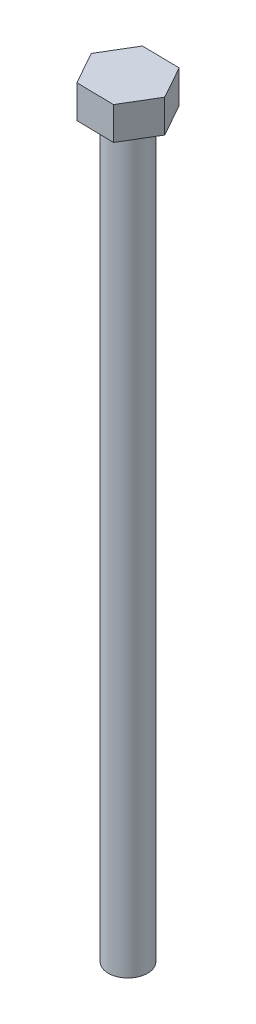
ISO-10303-21;
HEADER;
FILE_DESCRIPTION(('STEP AP214'),'2;1');
FILE_NAME('part.step','',(''),(''),'','','');
FILE_SCHEMA(('AUTOMOTIVE_DESIGN { 1 0 10303 214 1 1 1 1 }'));
ENDSEC;
DATA;
#1=APPLICATION_CONTEXT('core data for automotive mechanical design processes');
#2=APPLICATION_PROTOCOL_DEFINITION('international standard','automotive_design',2000,#1);
#3=PRODUCT_CONTEXT('',#1,'mechanical');
#4=PRODUCT('Part','Part','',(#3));
#5=PRODUCT_RELATED_PRODUCT_CATEGORY('part','',(#4));
#6=PRODUCT_DEFINITION_FORMATION('','',#4);
#7=PRODUCT_DEFINITION_CONTEXT('part definition',#1,'design');
#8=PRODUCT_DEFINITION('design','',#6,#7);
#9=PRODUCT_DEFINITION_SHAPE('','',#8);
#10=(LENGTH_UNIT() NAMED_UNIT(*) SI_UNIT(.MILLI.,.METRE.));
#11=(NAMED_UNIT(*) PLANE_ANGLE_UNIT() SI_UNIT($,.RADIAN.));
#12=(NAMED_UNIT(*) SI_UNIT($,.STERADIAN.) SOLID_ANGLE_UNIT());
#13=UNCERTAINTY_MEASURE_WITH_UNIT(LENGTH_MEASURE(1.E-05),#10,'distance_accuracy_value','');
#14=(GEOMETRIC_REPRESENTATION_CONTEXT(3) GLOBAL_UNCERTAINTY_ASSIGNED_CONTEXT((#13)) GLOBAL_UNIT_ASSIGNED_CONTEXT((#10,
#11,#12)) REPRESENTATION_CONTEXT('',''));
#15=CARTESIAN_POINT('',(0.,0.,0.));
#16=DIRECTION('',(0.,0.,1.));
#17=DIRECTION('',(1.,0.,0.));
#18=AXIS2_PLACEMENT_3D('',#15,#16,#17);
#19=CARTESIAN_POINT('',(0.,112.,0.));
#20=DIRECTION('',(0.,-1.,0.));
#21=DIRECTION('',(0.,0.,-1.));
#22=AXIS2_PLACEMENT_3D('',#19,#20,#21);
#23=CYLINDRICAL_SURFACE('',#22,3.);
#24=CARTESIAN_POINT('',(0.,112.,0.));
#25=DIRECTION('',(0.,1.,0.));
#26=DIRECTION('',(0.,0.,1.));
#27=AXIS2_PLACEMENT_3D('',#24,#25,#26);
#28=CIRCLE('',#27,3.);
#29=CARTESIAN_POINT('',(0.,112.,3.));
#30=VERTEX_POINT('',#29);
#31=EDGE_CURVE('E11',#30,#30,#28,.T.);
#32=ORIENTED_EDGE('',*,*,#31,.F.);
#33=EDGE_LOOP('',(#32));
#34=FACE_BOUND('',#33,.T.);
#35=CARTESIAN_POINT('',(0.,0.,0.));
#36=DIRECTION('',(0.,1.,0.));
#37=DIRECTION('',(0.,0.,1.));
#38=AXIS2_PLACEMENT_3D('',#35,#36,#37);
#39=CIRCLE('',#38,3.);
#40=CARTESIAN_POINT('',(0.,0.,3.));
#41=VERTEX_POINT('',#40);
#42=EDGE_CURVE('E36',#41,#41,#39,.T.);
#43=ORIENTED_EDGE('',*,*,#42,.T.);
#44=EDGE_LOOP('',(#43));
#45=FACE_BOUND('',#44,.T.);
#46=ADVANCED_FACE('F33',(#34,#45),#23,.T.);
#47=CARTESIAN_POINT('',(0.,0.,0.));
#48=DIRECTION('',(0.,1.,0.));
#49=DIRECTION('',(0.,0.,1.));
#50=AXIS2_PLACEMENT_3D('',#47,#48,#49);
#51=PLANE('',#50);
#52=ORIENTED_EDGE('',*,*,#42,.F.);
#53=EDGE_LOOP('',(#52));
#54=FACE_BOUND('',#53,.T.);
#55=ADVANCED_FACE('F141',(#54),#51,.F.);
#56=CARTESIAN_POINT('',(5.68176027461235,117.,0.0886843846860412));
#57=DIRECTION('',(-0.873723283610165,0.,0.486423296807906));
#58=DIRECTION('',(0.486423296807906,0.,0.873723283610165));
#59=AXIS2_PLACEMENT_3D('',#56,#57,#58);
#60=PLANE('',#59);
#61=DIRECTION('',(-0.486423296807906,0.,-0.873723283610165));
#62=VECTOR('',#61,1.);
#63=CARTESIAN_POINT('',(5.68176027461235,112.,0.0886843846860412));
#64=LINE('',#63,#62);
#65=CARTESIAN_POINT('',(5.68176027461235,112.,0.0886843846860412));
#66=VERTEX_POINT('',#65);
#67=CARTESIAN_POINT('',(2.91768306736328,112.,-4.87620654368452));
#68=VERTEX_POINT('',#67);
#69=EDGE_CURVE('E118',#66,#68,#64,.T.);
#70=ORIENTED_EDGE('',*,*,#69,.T.);
#71=DIRECTION('',(0.,-1.,0.));
#72=VECTOR('',#71,1.);
#73=CARTESIAN_POINT('',(2.91768306736328,117.,-4.87620654368452));
#74=LINE('',#73,#72);
#75=CARTESIAN_POINT('',(2.91768306736328,117.,-4.87620654368452));
#76=VERTEX_POINT('',#75);
#77=EDGE_CURVE('E135',#76,#68,#74,.T.);
#78=ORIENTED_EDGE('',*,*,#77,.F.);
#79=DIRECTION('',(-0.486423296807906,0.,-0.873723283610165));
#80=VECTOR('',#79,1.);
#81=CARTESIAN_POINT('',(5.68176027461235,117.,0.0886843846860412));
#82=LINE('',#81,#80);
#83=CARTESIAN_POINT('',(5.68176027461235,117.,0.0886843846860412));
#84=VERTEX_POINT('',#83);
#85=EDGE_CURVE('E128',#84,#76,#82,.T.);
#86=ORIENTED_EDGE('',*,*,#85,.F.);
#87=DIRECTION('',(0.,-1.,0.));
#88=VECTOR('',#87,1.);
#89=CARTESIAN_POINT('',(5.68176027461235,117.,0.0886843846860412));
#90=LINE('',#89,#88);
#91=EDGE_CURVE('E114',#84,#66,#90,.T.);
#92=ORIENTED_EDGE('',*,*,#91,.T.);
#93=EDGE_LOOP('',(#70,#78,#86,#92));
#94=FACE_BOUND('',#93,.T.);
#95=ADVANCED_FACE('F143',(#94),#60,.F.);
#96=CARTESIAN_POINT('',(2.91768306736328,117.,-4.87620654368452));
#97=DIRECTION('',(-0.0156067097768582,0.,0.999878207888311));
#98=DIRECTION('',(0.999878207888311,0.,0.0156067097768582));
#99=AXIS2_PLACEMENT_3D('',#96,#97,#98);
#100=PLANE('',#99);
#101=DIRECTION('',(-0.999878207888311,0.,-0.0156067097768582));
#102=VECTOR('',#101,1.);
#103=CARTESIAN_POINT('',(2.91768306736328,112.,-4.87620654368452));
#104=LINE('',#103,#102);
#105=CARTESIAN_POINT('',(-2.76407720724907,112.,-4.96489092837056));
#106=VERTEX_POINT('',#105);
#107=EDGE_CURVE('E121',#68,#106,#104,.T.);
#108=ORIENTED_EDGE('',*,*,#107,.T.);
#109=DIRECTION('',(0.,-1.,0.));
#110=VECTOR('',#109,1.);
#111=CARTESIAN_POINT('',(-2.76407720724907,117.,-4.96489092837056));
#112=LINE('',#111,#110);
#113=CARTESIAN_POINT('',(-2.76407720724907,117.,-4.96489092837056));
#114=VERTEX_POINT('',#113);
#115=EDGE_CURVE('E132',#114,#106,#112,.T.);
#116=ORIENTED_EDGE('',*,*,#115,.F.);
#117=DIRECTION('',(-0.999878207888311,0.,-0.0156067097768582));
#118=VECTOR('',#117,1.);
#119=CARTESIAN_POINT('',(2.91768306736328,117.,-4.87620654368452));
#120=LINE('',#119,#118);
#121=EDGE_CURVE('E87',#76,#114,#120,.T.);
#122=ORIENTED_EDGE('',*,*,#121,.F.);
#123=ORIENTED_EDGE('',*,*,#77,.T.);
#124=EDGE_LOOP('',(#108,#116,#122,#123));
#125=FACE_BOUND('',#124,.T.);
#126=ADVANCED_FACE('F148',(#125),#100,.F.);
#127=CARTESIAN_POINT('',(-2.76407720724907,117.,-4.96489092837056));
#128=DIRECTION('',(0.858116573833307,0.,0.513454911080405));
#129=DIRECTION('',(0.513454911080405,0.,-0.858116573833307));
#130=AXIS2_PLACEMENT_3D('',#127,#128,#129);
#131=PLANE('',#130);
#132=DIRECTION('',(-0.513454911080405,0.,0.858116573833307));
#133=VECTOR('',#132,1.);
#134=CARTESIAN_POINT('',(-2.76407720724907,112.,-4.96489092837056));
#135=LINE('',#134,#133);
#136=CARTESIAN_POINT('',(-5.68176027461235,112.,-0.0886843846860386));
#137=VERTEX_POINT('',#136);
#138=EDGE_CURVE('E123',#106,#137,#135,.T.);
#139=ORIENTED_EDGE('',*,*,#138,.T.);
#140=DIRECTION('',(0.,-1.,0.));
#141=VECTOR('',#140,1.);
#142=CARTESIAN_POINT('',(-5.68176027461235,117.,-0.0886843846860386));
#143=LINE('',#142,#141);
#144=CARTESIAN_POINT('',(-5.68176027461235,117.,-0.0886843846860386));
#145=VERTEX_POINT('',#144);
#146=EDGE_CURVE('E109',#145,#137,#143,.T.);
#147=ORIENTED_EDGE('',*,*,#146,.F.);
#148=DIRECTION('',(-0.513454911080405,0.,0.858116573833307));
#149=VECTOR('',#148,1.);
#150=CARTESIAN_POINT('',(-2.76407720724907,117.,-4.96489092837056));
#151=LINE('',#150,#149);
#152=EDGE_CURVE('E100',#114,#145,#151,.T.);
#153=ORIENTED_EDGE('',*,*,#152,.F.);
#154=ORIENTED_EDGE('',*,*,#115,.T.);
#155=EDGE_LOOP('',(#139,#147,#153,#154));
#156=FACE_BOUND('',#155,.T.);
#157=ADVANCED_FACE('F155',(#156),#131,.F.);
#158=CARTESIAN_POINT('',(-5.68176027461235,117.,-0.0886843846860386));
#159=DIRECTION('',(0.873723283610164,0.,-0.486423296807906));
#160=DIRECTION('',(-0.486423296807906,0.,-0.873723283610164));
#161=AXIS2_PLACEMENT_3D('',#158,#159,#160);
#162=PLANE('',#161);
#163=DIRECTION('',(0.486423296807906,0.,0.873723283610164));
#164=VECTOR('',#163,1.);
#165=CARTESIAN_POINT('',(-5.68176027461235,112.,-0.0886843846860386));
#166=LINE('',#165,#164);
#167=CARTESIAN_POINT('',(-2.91768306736328,112.,4.87620654368452));
#168=VERTEX_POINT('',#167);
#169=EDGE_CURVE('E108',#137,#168,#166,.T.);
#170=ORIENTED_EDGE('',*,*,#169,.T.);
#171=DIRECTION('',(0.,-1.,0.));
#172=VECTOR('',#171,1.);
#173=CARTESIAN_POINT('',(-2.91768306736328,117.,4.87620654368452));
#174=LINE('',#173,#172);
#175=CARTESIAN_POINT('',(-2.91768306736328,117.,4.87620654368452));
#176=VERTEX_POINT('',#175);
#177=EDGE_CURVE('E105',#176,#168,#174,.T.);
#178=ORIENTED_EDGE('',*,*,#177,.F.);
#179=DIRECTION('',(0.486423296807906,0.,0.873723283610164));
#180=VECTOR('',#179,1.);
#181=CARTESIAN_POINT('',(-5.68176027461235,117.,-0.0886843846860386));
#182=LINE('',#181,#180);
#183=EDGE_CURVE('E94',#145,#176,#182,.T.);
#184=ORIENTED_EDGE('',*,*,#183,.F.);
#185=ORIENTED_EDGE('',*,*,#146,.T.);
#186=EDGE_LOOP('',(#170,#178,#184,#185));
#187=FACE_BOUND('',#186,.T.);
#188=ADVANCED_FACE('F106',(#187),#162,.F.);
#189=CARTESIAN_POINT('',(-2.91768306736328,117.,4.87620654368452));
#190=DIRECTION('',(0.0156067097768581,0.,-0.999878207888311));
#191=DIRECTION('',(-0.999878207888311,0.,-0.0156067097768581));
#192=AXIS2_PLACEMENT_3D('',#189,#190,#191);
#193=PLANE('',#192);
#194=DIRECTION('',(0.999878207888311,0.,0.0156067097768581));
#195=VECTOR('',#194,1.);
#196=CARTESIAN_POINT('',(-2.91768306736328,112.,4.87620654368452));
#197=LINE('',#196,#195);
#198=CARTESIAN_POINT('',(2.76407720724907,112.,4.96489092837056));
#199=VERTEX_POINT('',#198);
#200=EDGE_CURVE('E72',#168,#199,#197,.T.);
#201=ORIENTED_EDGE('',*,*,#200,.T.);
#202=DIRECTION('',(0.,-1.,0.));
#203=VECTOR('',#202,1.);
#204=CARTESIAN_POINT('',(2.76407720724907,117.,4.96489092837056));
#205=LINE('',#204,#203);
#206=CARTESIAN_POINT('',(2.76407720724907,117.,4.96489092837056));
#207=VERTEX_POINT('',#206);
#208=EDGE_CURVE('E110',#207,#199,#205,.T.);
#209=ORIENTED_EDGE('',*,*,#208,.F.);
#210=DIRECTION('',(0.999878207888311,0.,0.0156067097768581));
#211=VECTOR('',#210,1.);
#212=CARTESIAN_POINT('',(-2.91768306736328,117.,4.87620654368452));
#213=LINE('',#212,#211);
#214=EDGE_CURVE('E98',#176,#207,#213,.T.);
#215=ORIENTED_EDGE('',*,*,#214,.F.);
#216=ORIENTED_EDGE('',*,*,#177,.T.);
#217=EDGE_LOOP('',(#201,#209,#215,#216));
#218=FACE_BOUND('',#217,.T.);
#219=ADVANCED_FACE('F112',(#218),#193,.F.);
#220=CARTESIAN_POINT('',(2.76407720724907,117.,4.96489092837056));
#221=DIRECTION('',(-0.858116573833307,0.,-0.513454911080405));
#222=DIRECTION('',(-0.513454911080405,0.,0.858116573833307));
#223=AXIS2_PLACEMENT_3D('',#220,#221,#222);
#224=PLANE('',#223);
#225=DIRECTION('',(0.513454911080405,0.,-0.858116573833307));
#226=VECTOR('',#225,1.);
#227=CARTESIAN_POINT('',(2.76407720724907,112.,4.96489092837056));
#228=LINE('',#227,#226);
#229=EDGE_CURVE('E78',#199,#66,#228,.T.);
#230=ORIENTED_EDGE('',*,*,#229,.T.);
#231=ORIENTED_EDGE('',*,*,#91,.F.);
#232=DIRECTION('',(0.513454911080405,0.,-0.858116573833307));
#233=VECTOR('',#232,1.);
#234=CARTESIAN_POINT('',(2.76407720724907,117.,4.96489092837056));
#235=LINE('',#234,#233);
#236=EDGE_CURVE('E49',#207,#84,#235,.T.);
#237=ORIENTED_EDGE('',*,*,#236,.F.);
#238=ORIENTED_EDGE('',*,*,#208,.T.);
#239=EDGE_LOOP('',(#230,#231,#237,#238));
#240=FACE_BOUND('',#239,.T.);
#241=ADVANCED_FACE('F163',(#240),#224,.F.);
#242=CARTESIAN_POINT('',(0.,117.,0.));
#243=DIRECTION('',(0.,1.,0.));
#244=DIRECTION('',(0.,0.,1.));
#245=AXIS2_PLACEMENT_3D('',#242,#243,#244);
#246=PLANE('',#245);
#247=ORIENTED_EDGE('',*,*,#85,.T.);
#248=ORIENTED_EDGE('',*,*,#121,.T.);
#249=ORIENTED_EDGE('',*,*,#152,.T.);
#250=ORIENTED_EDGE('',*,*,#183,.T.);
#251=ORIENTED_EDGE('',*,*,#214,.T.);
#252=ORIENTED_EDGE('',*,*,#236,.T.);
#253=EDGE_LOOP('',(#247,#248,#249,#250,#251,#252));
#254=FACE_BOUND('',#253,.T.);
#255=ADVANCED_FACE('F96',(#254),#246,.T.);
#256=CARTESIAN_POINT('',(0.,112.,0.));
#257=DIRECTION('',(0.,1.,0.));
#258=DIRECTION('',(0.,0.,1.));
#259=AXIS2_PLACEMENT_3D('',#256,#257,#258);
#260=PLANE('',#259);
#261=ORIENTED_EDGE('',*,*,#31,.T.);
#262=EDGE_LOOP('',(#261));
#263=FACE_BOUND('',#262,.T.);
#264=ORIENTED_EDGE('',*,*,#69,.F.);
#265=ORIENTED_EDGE('',*,*,#229,.F.);
#266=ORIENTED_EDGE('',*,*,#200,.F.);
#267=ORIENTED_EDGE('',*,*,#169,.F.);
#268=ORIENTED_EDGE('',*,*,#138,.F.);
#269=ORIENTED_EDGE('',*,*,#107,.F.);
#270=EDGE_LOOP('',(#264,#265,#266,#267,#268,#269));
#271=FACE_BOUND('',#270,.T.);
#272=ADVANCED_FACE('F166',(#263,#271),#260,.F.);
#273=CLOSED_SHELL('',(#46,#55,#95,#126,#157,#188,#219,#241,#255,#272));
#274=MANIFOLD_SOLID_BREP('B2',#273);
#275=ADVANCED_BREP_SHAPE_REPRESENTATION('',(#18,#274),#14);
#276=SHAPE_DEFINITION_REPRESENTATION(#9,#275);
ENDSEC;
END-ISO-10303-21;
